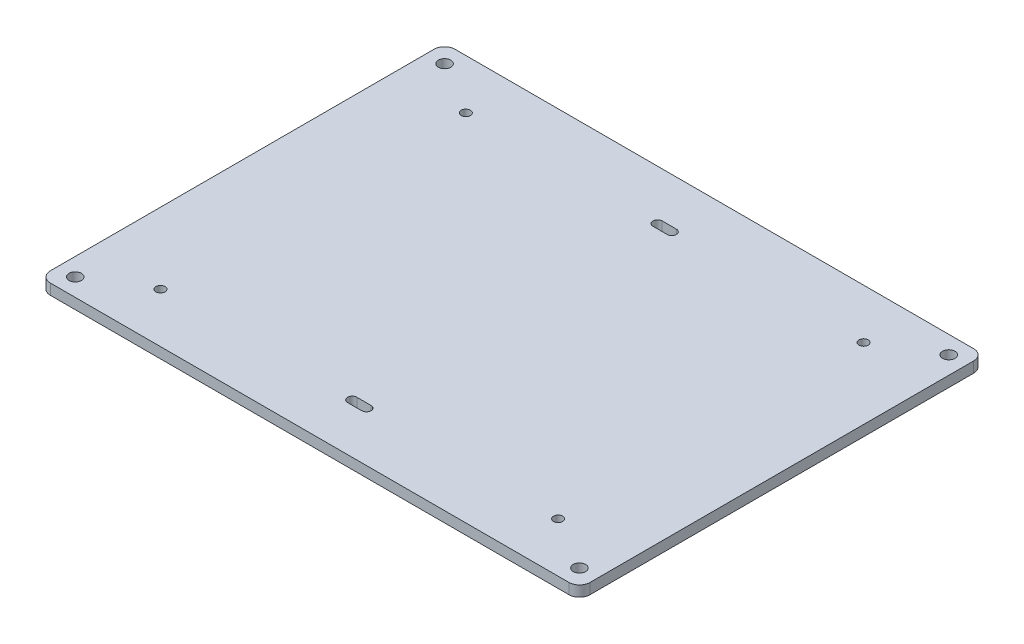
ISO-10303-21;
HEADER;
FILE_DESCRIPTION(('STEP AP214'),'2;1');
FILE_NAME('part.step','',(''),(''),'','','');
FILE_SCHEMA(('AUTOMOTIVE_DESIGN { 1 0 10303 214 1 1 1 1 }'));
ENDSEC;
DATA;
#1=APPLICATION_CONTEXT('core data for automotive mechanical design processes');
#2=APPLICATION_PROTOCOL_DEFINITION('international standard','automotive_design',2000,#1);
#3=PRODUCT_CONTEXT('',#1,'mechanical');
#4=PRODUCT('Part','Part','',(#3));
#5=PRODUCT_RELATED_PRODUCT_CATEGORY('part','',(#4));
#6=PRODUCT_DEFINITION_FORMATION('','',#4);
#7=PRODUCT_DEFINITION_CONTEXT('part definition',#1,'design');
#8=PRODUCT_DEFINITION('design','',#6,#7);
#9=PRODUCT_DEFINITION_SHAPE('','',#8);
#10=(LENGTH_UNIT() NAMED_UNIT(*) SI_UNIT(.MILLI.,.METRE.));
#11=(NAMED_UNIT(*) PLANE_ANGLE_UNIT() SI_UNIT($,.RADIAN.));
#12=(NAMED_UNIT(*) SI_UNIT($,.STERADIAN.) SOLID_ANGLE_UNIT());
#13=UNCERTAINTY_MEASURE_WITH_UNIT(LENGTH_MEASURE(1.E-05),#10,'distance_accuracy_value','');
#14=(GEOMETRIC_REPRESENTATION_CONTEXT(3) GLOBAL_UNCERTAINTY_ASSIGNED_CONTEXT((#13)) GLOBAL_UNIT_ASSIGNED_CONTEXT((#10,
#11,#12)) REPRESENTATION_CONTEXT('',''));
#15=CARTESIAN_POINT('',(0.,0.,0.));
#16=DIRECTION('',(0.,0.,1.));
#17=DIRECTION('',(1.,0.,0.));
#18=AXIS2_PLACEMENT_3D('',#15,#16,#17);
#19=CARTESIAN_POINT('',(-73.,3.,-54.));
#20=DIRECTION('',(0.,1.,0.));
#21=DIRECTION('',(0.,0.,1.));
#22=AXIS2_PLACEMENT_3D('',#19,#20,#21);
#23=PLANE('',#22);
#24=CARTESIAN_POINT('',(55.9999999999991,3.,43.));
#25=DIRECTION('',(0.,1.,0.));
#26=DIRECTION('',(0.,0.,-1.));
#27=AXIS2_PLACEMENT_3D('',#24,#25,#26);
#28=CIRCLE('',#27,1.30000000000002);
#29=CARTESIAN_POINT('',(55.9999999999991,3.,41.7));
#30=VERTEX_POINT('',#29);
#31=EDGE_CURVE('E191',#30,#30,#28,.T.);
#32=ORIENTED_EDGE('',*,*,#31,.F.);
#33=EDGE_LOOP('',(#32));
#34=FACE_BOUND('',#33,.T.);
#35=CARTESIAN_POINT('',(-70.9999999999989,3.,52.));
#36=DIRECTION('',(0.,1.,0.));
#37=DIRECTION('',(0.,0.,1.));
#38=AXIS2_PLACEMENT_3D('',#35,#36,#37);
#39=CIRCLE('',#38,1.75);
#40=CARTESIAN_POINT('',(-70.9999999999989,3.,53.75));
#41=VERTEX_POINT('',#40);
#42=EDGE_CURVE('E234',#41,#41,#39,.T.);
#43=ORIENTED_EDGE('',*,*,#42,.F.);
#44=EDGE_LOOP('',(#43));
#45=FACE_BOUND('',#44,.T.);
#46=CARTESIAN_POINT('',(71.,3.,-52.));
#47=DIRECTION('',(0.,1.,0.));
#48=DIRECTION('',(0.,0.,1.));
#49=AXIS2_PLACEMENT_3D('',#46,#47,#48);
#50=CIRCLE('',#49,1.75);
#51=CARTESIAN_POINT('',(71.,3.,-50.25));
#52=VERTEX_POINT('',#51);
#53=EDGE_CURVE('E246',#52,#52,#50,.T.);
#54=ORIENTED_EDGE('',*,*,#53,.F.);
#55=EDGE_LOOP('',(#54));
#56=FACE_BOUND('',#55,.T.);
#57=CARTESIAN_POINT('',(-71.,3.,-52.));
#58=DIRECTION('',(0.,1.,0.));
#59=DIRECTION('',(0.,0.,1.));
#60=AXIS2_PLACEMENT_3D('',#57,#58,#59);
#61=CIRCLE('',#60,1.75);
#62=CARTESIAN_POINT('',(-71.,3.,-50.25));
#63=VERTEX_POINT('',#62);
#64=EDGE_CURVE('E258',#63,#63,#61,.T.);
#65=ORIENTED_EDGE('',*,*,#64,.F.);
#66=EDGE_LOOP('',(#65));
#67=FACE_BOUND('',#66,.T.);
#68=CARTESIAN_POINT('',(-73.,3.,-54.));
#69=DIRECTION('',(0.,1.,0.));
#70=DIRECTION('',(0.,0.,1.));
#71=AXIS2_PLACEMENT_3D('',#68,#69,#70);
#72=CIRCLE('',#71,3.);
#73=CARTESIAN_POINT('',(-73.,3.,-57.));
#74=VERTEX_POINT('',#73);
#75=CARTESIAN_POINT('',(-76.,3.,-54.));
#76=VERTEX_POINT('',#75);
#77=EDGE_CURVE('E264',#74,#76,#72,.T.);
#78=ORIENTED_EDGE('',*,*,#77,.T.);
#79=DIRECTION('',(0.,0.,1.));
#80=VECTOR('',#79,1.);
#81=CARTESIAN_POINT('',(-76.,3.,-54.));
#82=LINE('',#81,#80);
#83=CARTESIAN_POINT('',(-76.,3.,54.));
#84=VERTEX_POINT('',#83);
#85=EDGE_CURVE('E267',#76,#84,#82,.T.);
#86=ORIENTED_EDGE('',*,*,#85,.T.);
#87=CARTESIAN_POINT('',(-73.,3.,54.));
#88=DIRECTION('',(0.,1.,0.));
#89=DIRECTION('',(0.,0.,-1.));
#90=AXIS2_PLACEMENT_3D('',#87,#88,#89);
#91=CIRCLE('',#90,3.);
#92=CARTESIAN_POINT('',(-73.,3.,57.));
#93=VERTEX_POINT('',#92);
#94=EDGE_CURVE('E270',#84,#93,#91,.T.);
#95=ORIENTED_EDGE('',*,*,#94,.T.);
#96=DIRECTION('',(1.,0.,0.));
#97=VECTOR('',#96,1.);
#98=CARTESIAN_POINT('',(-73.,3.,57.));
#99=LINE('',#98,#97);
#100=CARTESIAN_POINT('',(73.,3.,57.));
#101=VERTEX_POINT('',#100);
#102=EDGE_CURVE('E272',#93,#101,#99,.T.);
#103=ORIENTED_EDGE('',*,*,#102,.T.);
#104=CARTESIAN_POINT('',(73.,3.,54.));
#105=DIRECTION('',(0.,1.,0.));
#106=DIRECTION('',(0.,0.,1.));
#107=AXIS2_PLACEMENT_3D('',#104,#105,#106);
#108=CIRCLE('',#107,3.);
#109=CARTESIAN_POINT('',(76.,3.,54.));
#110=VERTEX_POINT('',#109);
#111=EDGE_CURVE('E274',#101,#110,#108,.T.);
#112=ORIENTED_EDGE('',*,*,#111,.T.);
#113=DIRECTION('',(0.,0.,-1.));
#114=VECTOR('',#113,1.);
#115=CARTESIAN_POINT('',(76.,3.,-54.));
#116=LINE('',#115,#114);
#117=CARTESIAN_POINT('',(76.,3.,-54.));
#118=VERTEX_POINT('',#117);
#119=EDGE_CURVE('E276',#110,#118,#116,.T.);
#120=ORIENTED_EDGE('',*,*,#119,.T.);
#121=CARTESIAN_POINT('',(73.,3.,-54.));
#122=DIRECTION('',(0.,1.,0.));
#123=DIRECTION('',(0.,0.,1.));
#124=AXIS2_PLACEMENT_3D('',#121,#122,#123);
#125=CIRCLE('',#124,3.);
#126=CARTESIAN_POINT('',(72.9999999999999,3.,-57.));
#127=VERTEX_POINT('',#126);
#128=EDGE_CURVE('E278',#118,#127,#125,.T.);
#129=ORIENTED_EDGE('',*,*,#128,.T.);
#130=DIRECTION('',(-1.,0.,0.));
#131=VECTOR('',#130,1.);
#132=CARTESIAN_POINT('',(-73.,3.,-57.));
#133=LINE('',#132,#131);
#134=EDGE_CURVE('E280',#127,#74,#133,.T.);
#135=ORIENTED_EDGE('',*,*,#134,.T.);
#136=EDGE_LOOP('',(#78,#86,#95,#103,#112,#120,#129,#135));
#137=FACE_BOUND('',#136,.T.);
#138=CARTESIAN_POINT('',(-56.,3.,-43.));
#139=DIRECTION('',(0.,1.,0.));
#140=DIRECTION('',(0.,0.,1.));
#141=AXIS2_PLACEMENT_3D('',#138,#139,#140);
#142=CIRCLE('',#141,1.3);
#143=CARTESIAN_POINT('',(-56.,3.,-41.7));
#144=VERTEX_POINT('',#143);
#145=EDGE_CURVE('E252',#144,#144,#142,.T.);
#146=ORIENTED_EDGE('',*,*,#145,.F.);
#147=EDGE_LOOP('',(#146));
#148=FACE_BOUND('',#147,.T.);
#149=CARTESIAN_POINT('',(71.0000000000011,3.,52.));
#150=DIRECTION('',(0.,1.,0.));
#151=DIRECTION('',(0.,0.,1.));
#152=AXIS2_PLACEMENT_3D('',#149,#150,#151);
#153=CIRCLE('',#152,1.75);
#154=CARTESIAN_POINT('',(71.0000000000011,3.,53.75));
#155=VERTEX_POINT('',#154);
#156=EDGE_CURVE('E240',#155,#155,#153,.T.);
#157=ORIENTED_EDGE('',*,*,#156,.F.);
#158=EDGE_LOOP('',(#157));
#159=FACE_BOUND('',#158,.T.);
#160=CARTESIAN_POINT('',(-55.9999999999991,3.,43.));
#161=DIRECTION('',(0.,1.,0.));
#162=DIRECTION('',(0.,0.,1.));
#163=AXIS2_PLACEMENT_3D('',#160,#161,#162);
#164=CIRCLE('',#163,1.3);
#165=CARTESIAN_POINT('',(-55.9999999999991,3.,44.3));
#166=VERTEX_POINT('',#165);
#167=EDGE_CURVE('E228',#166,#166,#164,.T.);
#168=ORIENTED_EDGE('',*,*,#167,.F.);
#169=EDGE_LOOP('',(#168));
#170=FACE_BOUND('',#169,.T.);
#171=DIRECTION('',(1.,0.,0.));
#172=VECTOR('',#171,1.);
#173=CARTESIAN_POINT('',(-2.00000000000007,3.,-41.7));
#174=LINE('',#173,#172);
#175=CARTESIAN_POINT('',(-2.00000000000007,3.,-41.7));
#176=VERTEX_POINT('',#175);
#177=CARTESIAN_POINT('',(1.99999999999999,3.,-41.7));
#178=VERTEX_POINT('',#177);
#179=EDGE_CURVE('E199',#176,#178,#174,.T.);
#180=ORIENTED_EDGE('',*,*,#179,.F.);
#181=CARTESIAN_POINT('',(-2.00000000000007,3.,-43.));
#182=DIRECTION('',(0.,1.,0.));
#183=DIRECTION('',(0.,0.,-1.));
#184=AXIS2_PLACEMENT_3D('',#181,#182,#183);
#185=CIRCLE('',#184,1.3);
#186=CARTESIAN_POINT('',(-2.00000000000007,3.,-44.3));
#187=VERTEX_POINT('',#186);
#188=EDGE_CURVE('E197',#187,#176,#185,.T.);
#189=ORIENTED_EDGE('',*,*,#188,.F.);
#190=DIRECTION('',(-1.,0.,0.));
#191=VECTOR('',#190,1.);
#192=CARTESIAN_POINT('',(-2.00000000000007,3.,-44.3));
#193=LINE('',#192,#191);
#194=CARTESIAN_POINT('',(1.99999999999999,3.,-44.3));
#195=VERTEX_POINT('',#194);
#196=EDGE_CURVE('E205',#195,#187,#193,.T.);
#197=ORIENTED_EDGE('',*,*,#196,.F.);
#198=CARTESIAN_POINT('',(1.99999999999999,3.,-43.));
#199=DIRECTION('',(0.,1.,0.));
#200=DIRECTION('',(0.,0.,1.));
#201=AXIS2_PLACEMENT_3D('',#198,#199,#200);
#202=CIRCLE('',#201,1.3);
#203=EDGE_CURVE('E202',#178,#195,#202,.T.);
#204=ORIENTED_EDGE('',*,*,#203,.F.);
#205=EDGE_LOOP('',(#180,#189,#197,#204));
#206=FACE_BOUND('',#205,.T.);
#207=CARTESIAN_POINT('',(55.9999999999999,3.,-43.));
#208=DIRECTION('',(0.,1.,0.));
#209=DIRECTION('',(0.,0.,-1.));
#210=AXIS2_PLACEMENT_3D('',#207,#208,#209);
#211=CIRCLE('',#210,1.3);
#212=CARTESIAN_POINT('',(55.9999999999999,3.,-44.3));
#213=VERTEX_POINT('',#212);
#214=EDGE_CURVE('E185',#213,#213,#211,.T.);
#215=ORIENTED_EDGE('',*,*,#214,.F.);
#216=EDGE_LOOP('',(#215));
#217=FACE_BOUND('',#216,.T.);
#218=DIRECTION('',(1.,0.,0.));
#219=VECTOR('',#218,1.);
#220=CARTESIAN_POINT('',(-2.00000000000092,3.,44.3));
#221=LINE('',#220,#219);
#222=CARTESIAN_POINT('',(-2.00000000000092,3.,44.3));
#223=VERTEX_POINT('',#222);
#224=CARTESIAN_POINT('',(2.00000000000089,3.,44.3));
#225=VERTEX_POINT('',#224);
#226=EDGE_CURVE('E157',#223,#225,#221,.T.);
#227=ORIENTED_EDGE('',*,*,#226,.F.);
#228=CARTESIAN_POINT('',(-2.00000000000092,3.,43.));
#229=DIRECTION('',(0.,1.,0.));
#230=DIRECTION('',(0.,0.,-1.));
#231=AXIS2_PLACEMENT_3D('',#228,#229,#230);
#232=CIRCLE('',#231,1.3);
#233=CARTESIAN_POINT('',(-2.00000000000092,3.,41.7));
#234=VERTEX_POINT('',#233);
#235=EDGE_CURVE('E149',#234,#223,#232,.T.);
#236=ORIENTED_EDGE('',*,*,#235,.F.);
#237=DIRECTION('',(-1.,0.,0.));
#238=VECTOR('',#237,1.);
#239=CARTESIAN_POINT('',(-2.00000000000092,3.,41.7));
#240=LINE('',#239,#238);
#241=CARTESIAN_POINT('',(2.00000000000089,3.,41.7));
#242=VERTEX_POINT('',#241);
#243=EDGE_CURVE('E171',#242,#234,#240,.T.);
#244=ORIENTED_EDGE('',*,*,#243,.F.);
#245=CARTESIAN_POINT('',(2.00000000000089,3.,43.));
#246=DIRECTION('',(0.,1.,0.));
#247=DIRECTION('',(0.,0.,1.));
#248=AXIS2_PLACEMENT_3D('',#245,#246,#247);
#249=CIRCLE('',#248,1.3);
#250=EDGE_CURVE('E169',#225,#242,#249,.T.);
#251=ORIENTED_EDGE('',*,*,#250,.F.);
#252=EDGE_LOOP('',(#227,#236,#244,#251));
#253=FACE_BOUND('',#252,.T.);
#254=ADVANCED_FACE('F36',(#34,#45,#56,#67,#137,#148,#159,#170,#206,#217,#253),#23,.T.);
#255=CARTESIAN_POINT('',(-73.,0.,-54.));
#256=DIRECTION('',(0.,1.,0.));
#257=DIRECTION('',(0.,0.,1.));
#258=AXIS2_PLACEMENT_3D('',#255,#256,#257);
#259=PLANE('',#258);
#260=CARTESIAN_POINT('',(55.9999999999999,0.,-43.));
#261=DIRECTION('',(0.,1.,0.));
#262=DIRECTION('',(0.,0.,-1.));
#263=AXIS2_PLACEMENT_3D('',#260,#261,#262);
#264=CIRCLE('',#263,1.3);
#265=CARTESIAN_POINT('',(55.9999999999999,0.,-44.3));
#266=VERTEX_POINT('',#265);
#267=EDGE_CURVE('E165',#266,#266,#264,.T.);
#268=ORIENTED_EDGE('',*,*,#267,.T.);
#269=EDGE_LOOP('',(#268));
#270=FACE_BOUND('',#269,.T.);
#271=CARTESIAN_POINT('',(55.9999999999991,0.,43.));
#272=DIRECTION('',(0.,1.,0.));
#273=DIRECTION('',(0.,0.,-1.));
#274=AXIS2_PLACEMENT_3D('',#271,#272,#273);
#275=CIRCLE('',#274,1.30000000000002);
#276=CARTESIAN_POINT('',(55.9999999999991,0.,41.7));
#277=VERTEX_POINT('',#276);
#278=EDGE_CURVE('E188',#277,#277,#275,.T.);
#279=ORIENTED_EDGE('',*,*,#278,.T.);
#280=EDGE_LOOP('',(#279));
#281=FACE_BOUND('',#280,.T.);
#282=CARTESIAN_POINT('',(-2.00000000000007,0.,-43.));
#283=DIRECTION('',(0.,1.,0.));
#284=DIRECTION('',(0.,0.,-1.));
#285=AXIS2_PLACEMENT_3D('',#282,#283,#284);
#286=CIRCLE('',#285,1.3);
#287=CARTESIAN_POINT('',(-2.00000000000007,0.,-44.3));
#288=VERTEX_POINT('',#287);
#289=CARTESIAN_POINT('',(-2.00000000000007,0.,-41.7));
#290=VERTEX_POINT('',#289);
#291=EDGE_CURVE('E194',#288,#290,#286,.T.);
#292=ORIENTED_EDGE('',*,*,#291,.T.);
#293=DIRECTION('',(1.,0.,0.));
#294=VECTOR('',#293,1.);
#295=CARTESIAN_POINT('',(-2.00000000000007,0.,-41.7));
#296=LINE('',#295,#294);
#297=CARTESIAN_POINT('',(1.99999999999999,0.,-41.7));
#298=VERTEX_POINT('',#297);
#299=EDGE_CURVE('E210',#290,#298,#296,.T.);
#300=ORIENTED_EDGE('',*,*,#299,.T.);
#301=CARTESIAN_POINT('',(1.99999999999999,0.,-43.));
#302=DIRECTION('',(0.,1.,0.));
#303=DIRECTION('',(0.,0.,1.));
#304=AXIS2_PLACEMENT_3D('',#301,#302,#303);
#305=CIRCLE('',#304,1.3);
#306=CARTESIAN_POINT('',(1.99999999999999,0.,-44.3));
#307=VERTEX_POINT('',#306);
#308=EDGE_CURVE('E213',#298,#307,#305,.T.);
#309=ORIENTED_EDGE('',*,*,#308,.T.);
#310=DIRECTION('',(-1.,0.,0.));
#311=VECTOR('',#310,1.);
#312=CARTESIAN_POINT('',(-2.00000000000007,0.,-44.3));
#313=LINE('',#312,#311);
#314=EDGE_CURVE('E200',#307,#288,#313,.T.);
#315=ORIENTED_EDGE('',*,*,#314,.T.);
#316=EDGE_LOOP('',(#292,#300,#309,#315));
#317=FACE_BOUND('',#316,.T.);
#318=CARTESIAN_POINT('',(-73.,0.,-54.));
#319=DIRECTION('',(0.,1.,0.));
#320=DIRECTION('',(0.,0.,1.));
#321=AXIS2_PLACEMENT_3D('',#318,#319,#320);
#322=CIRCLE('',#321,3.);
#323=CARTESIAN_POINT('',(-73.,0.,-57.));
#324=VERTEX_POINT('',#323);
#325=CARTESIAN_POINT('',(-76.,0.,-54.));
#326=VERTEX_POINT('',#325);
#327=EDGE_CURVE('E261',#324,#326,#322,.T.);
#328=ORIENTED_EDGE('',*,*,#327,.F.);
#329=DIRECTION('',(-1.,0.,0.));
#330=VECTOR('',#329,1.);
#331=CARTESIAN_POINT('',(-73.,0.,-57.));
#332=LINE('',#331,#330);
#333=CARTESIAN_POINT('',(72.9999999999999,0.,-57.));
#334=VERTEX_POINT('',#333);
#335=EDGE_CURVE('E268',#334,#324,#332,.T.);
#336=ORIENTED_EDGE('',*,*,#335,.F.);
#337=CARTESIAN_POINT('',(73.,0.,-54.));
#338=DIRECTION('',(0.,1.,0.));
#339=DIRECTION('',(0.,0.,1.));
#340=AXIS2_PLACEMENT_3D('',#337,#338,#339);
#341=CIRCLE('',#340,3.);
#342=CARTESIAN_POINT('',(76.,0.,-54.));
#343=VERTEX_POINT('',#342);
#344=EDGE_CURVE('E295',#343,#334,#341,.T.);
#345=ORIENTED_EDGE('',*,*,#344,.F.);
#346=DIRECTION('',(0.,0.,-1.));
#347=VECTOR('',#346,1.);
#348=CARTESIAN_POINT('',(76.,0.,-54.));
#349=LINE('',#348,#347);
#350=CARTESIAN_POINT('',(76.,0.,54.));
#351=VERTEX_POINT('',#350);
#352=EDGE_CURVE('E293',#351,#343,#349,.T.);
#353=ORIENTED_EDGE('',*,*,#352,.F.);
#354=CARTESIAN_POINT('',(73.,0.,54.));
#355=DIRECTION('',(0.,1.,0.));
#356=DIRECTION('',(0.,0.,1.));
#357=AXIS2_PLACEMENT_3D('',#354,#355,#356);
#358=CIRCLE('',#357,3.);
#359=CARTESIAN_POINT('',(73.,0.,57.));
#360=VERTEX_POINT('',#359);
#361=EDGE_CURVE('E291',#360,#351,#358,.T.);
#362=ORIENTED_EDGE('',*,*,#361,.F.);
#363=DIRECTION('',(1.,0.,0.));
#364=VECTOR('',#363,1.);
#365=CARTESIAN_POINT('',(-73.,0.,57.));
#366=LINE('',#365,#364);
#367=CARTESIAN_POINT('',(-73.,0.,57.));
#368=VERTEX_POINT('',#367);
#369=EDGE_CURVE('E289',#368,#360,#366,.T.);
#370=ORIENTED_EDGE('',*,*,#369,.F.);
#371=CARTESIAN_POINT('',(-73.,0.,54.));
#372=DIRECTION('',(0.,1.,0.));
#373=DIRECTION('',(0.,0.,-1.));
#374=AXIS2_PLACEMENT_3D('',#371,#372,#373);
#375=CIRCLE('',#374,3.);
#376=CARTESIAN_POINT('',(-76.,0.,54.));
#377=VERTEX_POINT('',#376);
#378=EDGE_CURVE('E287',#377,#368,#375,.T.);
#379=ORIENTED_EDGE('',*,*,#378,.F.);
#380=DIRECTION('',(0.,0.,1.));
#381=VECTOR('',#380,1.);
#382=CARTESIAN_POINT('',(-76.,0.,-54.));
#383=LINE('',#382,#381);
#384=EDGE_CURVE('E285',#326,#377,#383,.T.);
#385=ORIENTED_EDGE('',*,*,#384,.F.);
#386=EDGE_LOOP('',(#328,#336,#345,#353,#362,#370,#379,#385));
#387=FACE_BOUND('',#386,.T.);
#388=CARTESIAN_POINT('',(-71.,0.,-52.));
#389=DIRECTION('',(0.,1.,0.));
#390=DIRECTION('',(0.,0.,1.));
#391=AXIS2_PLACEMENT_3D('',#388,#389,#390);
#392=CIRCLE('',#391,1.75);
#393=CARTESIAN_POINT('',(-71.,0.,-50.25));
#394=VERTEX_POINT('',#393);
#395=EDGE_CURVE('E255',#394,#394,#392,.T.);
#396=ORIENTED_EDGE('',*,*,#395,.T.);
#397=EDGE_LOOP('',(#396));
#398=FACE_BOUND('',#397,.T.);
#399=CARTESIAN_POINT('',(-56.,0.,-43.));
#400=DIRECTION('',(0.,1.,0.));
#401=DIRECTION('',(0.,0.,1.));
#402=AXIS2_PLACEMENT_3D('',#399,#400,#401);
#403=CIRCLE('',#402,1.3);
#404=CARTESIAN_POINT('',(-56.,0.,-41.7));
#405=VERTEX_POINT('',#404);
#406=EDGE_CURVE('E249',#405,#405,#403,.T.);
#407=ORIENTED_EDGE('',*,*,#406,.T.);
#408=EDGE_LOOP('',(#407));
#409=FACE_BOUND('',#408,.T.);
#410=CARTESIAN_POINT('',(71.,0.,-52.));
#411=DIRECTION('',(0.,1.,0.));
#412=DIRECTION('',(0.,0.,1.));
#413=AXIS2_PLACEMENT_3D('',#410,#411,#412);
#414=CIRCLE('',#413,1.75);
#415=CARTESIAN_POINT('',(71.,0.,-50.25));
#416=VERTEX_POINT('',#415);
#417=EDGE_CURVE('E243',#416,#416,#414,.T.);
#418=ORIENTED_EDGE('',*,*,#417,.T.);
#419=EDGE_LOOP('',(#418));
#420=FACE_BOUND('',#419,.T.);
#421=CARTESIAN_POINT('',(71.0000000000011,0.,52.));
#422=DIRECTION('',(0.,1.,0.));
#423=DIRECTION('',(0.,0.,1.));
#424=AXIS2_PLACEMENT_3D('',#421,#422,#423);
#425=CIRCLE('',#424,1.75);
#426=CARTESIAN_POINT('',(71.0000000000011,0.,53.75));
#427=VERTEX_POINT('',#426);
#428=EDGE_CURVE('E237',#427,#427,#425,.T.);
#429=ORIENTED_EDGE('',*,*,#428,.T.);
#430=EDGE_LOOP('',(#429));
#431=FACE_BOUND('',#430,.T.);
#432=CARTESIAN_POINT('',(-70.9999999999989,0.,52.));
#433=DIRECTION('',(0.,1.,0.));
#434=DIRECTION('',(0.,0.,1.));
#435=AXIS2_PLACEMENT_3D('',#432,#433,#434);
#436=CIRCLE('',#435,1.75);
#437=CARTESIAN_POINT('',(-70.9999999999989,0.,53.75));
#438=VERTEX_POINT('',#437);
#439=EDGE_CURVE('E231',#438,#438,#436,.T.);
#440=ORIENTED_EDGE('',*,*,#439,.T.);
#441=EDGE_LOOP('',(#440));
#442=FACE_BOUND('',#441,.T.);
#443=CARTESIAN_POINT('',(-55.9999999999991,0.,43.));
#444=DIRECTION('',(0.,1.,0.));
#445=DIRECTION('',(0.,0.,1.));
#446=AXIS2_PLACEMENT_3D('',#443,#444,#445);
#447=CIRCLE('',#446,1.3);
#448=CARTESIAN_POINT('',(-55.9999999999991,0.,44.3));
#449=VERTEX_POINT('',#448);
#450=EDGE_CURVE('E227',#449,#449,#447,.T.);
#451=ORIENTED_EDGE('',*,*,#450,.T.);
#452=EDGE_LOOP('',(#451));
#453=FACE_BOUND('',#452,.T.);
#454=CARTESIAN_POINT('',(-2.00000000000092,0.,43.));
#455=DIRECTION('',(0.,1.,0.));
#456=DIRECTION('',(0.,0.,-1.));
#457=AXIS2_PLACEMENT_3D('',#454,#455,#456);
#458=CIRCLE('',#457,1.3);
#459=CARTESIAN_POINT('',(-2.00000000000092,0.,41.7));
#460=VERTEX_POINT('',#459);
#461=CARTESIAN_POINT('',(-2.00000000000092,0.,44.3));
#462=VERTEX_POINT('',#461);
#463=EDGE_CURVE('E59',#460,#462,#458,.T.);
#464=ORIENTED_EDGE('',*,*,#463,.T.);
#465=DIRECTION('',(1.,0.,0.));
#466=VECTOR('',#465,1.);
#467=CARTESIAN_POINT('',(-2.00000000000092,0.,44.3));
#468=LINE('',#467,#466);
#469=CARTESIAN_POINT('',(2.00000000000089,0.,44.3));
#470=VERTEX_POINT('',#469);
#471=EDGE_CURVE('E164',#462,#470,#468,.T.);
#472=ORIENTED_EDGE('',*,*,#471,.T.);
#473=CARTESIAN_POINT('',(2.00000000000089,0.,43.));
#474=DIRECTION('',(0.,1.,0.));
#475=DIRECTION('',(0.,0.,1.));
#476=AXIS2_PLACEMENT_3D('',#473,#474,#475);
#477=CIRCLE('',#476,1.3);
#478=CARTESIAN_POINT('',(2.00000000000089,0.,41.7));
#479=VERTEX_POINT('',#478);
#480=EDGE_CURVE('E177',#470,#479,#477,.T.);
#481=ORIENTED_EDGE('',*,*,#480,.T.);
#482=DIRECTION('',(-1.,0.,0.));
#483=VECTOR('',#482,1.);
#484=CARTESIAN_POINT('',(-2.00000000000092,0.,41.7));
#485=LINE('',#484,#483);
#486=EDGE_CURVE('E158',#479,#460,#485,.T.);
#487=ORIENTED_EDGE('',*,*,#486,.T.);
#488=EDGE_LOOP('',(#464,#472,#481,#487));
#489=FACE_BOUND('',#488,.T.);
#490=ADVANCED_FACE('F325',(#270,#281,#317,#387,#398,#409,#420,#431,#442,#453,#489),#259,.F.);
#491=CARTESIAN_POINT('',(-73.,3.,-54.));
#492=DIRECTION('',(0.,-1.,0.));
#493=DIRECTION('',(0.,0.,-1.));
#494=AXIS2_PLACEMENT_3D('',#491,#492,#493);
#495=CYLINDRICAL_SURFACE('',#494,3.);
#496=ORIENTED_EDGE('',*,*,#327,.T.);
#497=DIRECTION('',(0.,-1.,0.));
#498=VECTOR('',#497,1.);
#499=CARTESIAN_POINT('',(-76.,3.,-54.));
#500=LINE('',#499,#498);
#501=EDGE_CURVE('E11',#76,#326,#500,.T.);
#502=ORIENTED_EDGE('',*,*,#501,.F.);
#503=ORIENTED_EDGE('',*,*,#77,.F.);
#504=DIRECTION('',(0.,-1.,0.));
#505=VECTOR('',#504,1.);
#506=CARTESIAN_POINT('',(-73.,3.,-57.));
#507=LINE('',#506,#505);
#508=EDGE_CURVE('E282',#74,#324,#507,.T.);
#509=ORIENTED_EDGE('',*,*,#508,.T.);
#510=EDGE_LOOP('',(#496,#502,#503,#509));
#511=FACE_BOUND('',#510,.T.);
#512=ADVANCED_FACE('F38',(#511),#495,.T.);
#513=CARTESIAN_POINT('',(-76.,3.,-54.));
#514=DIRECTION('',(1.,0.,0.));
#515=DIRECTION('',(0.,0.,-1.));
#516=AXIS2_PLACEMENT_3D('',#513,#514,#515);
#517=PLANE('',#516);
#518=ORIENTED_EDGE('',*,*,#384,.T.);
#519=DIRECTION('',(0.,-1.,0.));
#520=VECTOR('',#519,1.);
#521=CARTESIAN_POINT('',(-76.,3.,54.));
#522=LINE('',#521,#520);
#523=EDGE_CURVE('E44',#84,#377,#522,.T.);
#524=ORIENTED_EDGE('',*,*,#523,.F.);
#525=ORIENTED_EDGE('',*,*,#85,.F.);
#526=ORIENTED_EDGE('',*,*,#501,.T.);
#527=EDGE_LOOP('',(#518,#524,#525,#526));
#528=FACE_BOUND('',#527,.T.);
#529=ADVANCED_FACE('F343',(#528),#517,.F.);
#530=CARTESIAN_POINT('',(-73.,3.,54.));
#531=DIRECTION('',(0.,-1.,0.));
#532=DIRECTION('',(0.,0.,-1.));
#533=AXIS2_PLACEMENT_3D('',#530,#531,#532);
#534=CYLINDRICAL_SURFACE('',#533,3.);
#535=ORIENTED_EDGE('',*,*,#378,.T.);
#536=DIRECTION('',(0.,-1.,0.));
#537=VECTOR('',#536,1.);
#538=CARTESIAN_POINT('',(-73.,3.,57.));
#539=LINE('',#538,#537);
#540=EDGE_CURVE('E312',#93,#368,#539,.T.);
#541=ORIENTED_EDGE('',*,*,#540,.F.);
#542=ORIENTED_EDGE('',*,*,#94,.F.);
#543=ORIENTED_EDGE('',*,*,#523,.T.);
#544=EDGE_LOOP('',(#535,#541,#542,#543));
#545=FACE_BOUND('',#544,.T.);
#546=ADVANCED_FACE('F319',(#545),#534,.T.);
#547=CARTESIAN_POINT('',(-73.,3.,57.));
#548=DIRECTION('',(0.,0.,-1.));
#549=DIRECTION('',(-1.,0.,0.));
#550=AXIS2_PLACEMENT_3D('',#547,#548,#549);
#551=PLANE('',#550);
#552=ORIENTED_EDGE('',*,*,#369,.T.);
#553=DIRECTION('',(0.,-1.,0.));
#554=VECTOR('',#553,1.);
#555=CARTESIAN_POINT('',(73.,3.,57.));
#556=LINE('',#555,#554);
#557=EDGE_CURVE('E309',#101,#360,#556,.T.);
#558=ORIENTED_EDGE('',*,*,#557,.F.);
#559=ORIENTED_EDGE('',*,*,#102,.F.);
#560=ORIENTED_EDGE('',*,*,#540,.T.);
#561=EDGE_LOOP('',(#552,#558,#559,#560));
#562=FACE_BOUND('',#561,.T.);
#563=ADVANCED_FACE('F331',(#562),#551,.F.);
#564=CARTESIAN_POINT('',(73.,3.,54.));
#565=DIRECTION('',(0.,-1.,0.));
#566=DIRECTION('',(0.,0.,-1.));
#567=AXIS2_PLACEMENT_3D('',#564,#565,#566);
#568=CYLINDRICAL_SURFACE('',#567,3.);
#569=ORIENTED_EDGE('',*,*,#361,.T.);
#570=DIRECTION('',(0.,-1.,0.));
#571=VECTOR('',#570,1.);
#572=CARTESIAN_POINT('',(76.,3.,54.));
#573=LINE('',#572,#571);
#574=EDGE_CURVE('E306',#110,#351,#573,.T.);
#575=ORIENTED_EDGE('',*,*,#574,.F.);
#576=ORIENTED_EDGE('',*,*,#111,.F.);
#577=ORIENTED_EDGE('',*,*,#557,.T.);
#578=EDGE_LOOP('',(#569,#575,#576,#577));
#579=FACE_BOUND('',#578,.T.);
#580=ADVANCED_FACE('F335',(#579),#568,.T.);
#581=CARTESIAN_POINT('',(76.,3.,-54.));
#582=DIRECTION('',(-1.,0.,0.));
#583=DIRECTION('',(0.,0.,1.));
#584=AXIS2_PLACEMENT_3D('',#581,#582,#583);
#585=PLANE('',#584);
#586=ORIENTED_EDGE('',*,*,#352,.T.);
#587=DIRECTION('',(0.,-1.,0.));
#588=VECTOR('',#587,1.);
#589=CARTESIAN_POINT('',(76.,3.,-54.));
#590=LINE('',#589,#588);
#591=EDGE_CURVE('E303',#118,#343,#590,.T.);
#592=ORIENTED_EDGE('',*,*,#591,.F.);
#593=ORIENTED_EDGE('',*,*,#119,.F.);
#594=ORIENTED_EDGE('',*,*,#574,.T.);
#595=EDGE_LOOP('',(#586,#592,#593,#594));
#596=FACE_BOUND('',#595,.T.);
#597=ADVANCED_FACE('F356',(#596),#585,.F.);
#598=CARTESIAN_POINT('',(73.,3.,-54.));
#599=DIRECTION('',(0.,-1.,0.));
#600=DIRECTION('',(0.,0.,-1.));
#601=AXIS2_PLACEMENT_3D('',#598,#599,#600);
#602=CYLINDRICAL_SURFACE('',#601,3.);
#603=ORIENTED_EDGE('',*,*,#344,.T.);
#604=DIRECTION('',(0.,-1.,0.));
#605=VECTOR('',#604,1.);
#606=CARTESIAN_POINT('',(72.9999999999999,3.,-57.));
#607=LINE('',#606,#605);
#608=EDGE_CURVE('E300',#127,#334,#607,.T.);
#609=ORIENTED_EDGE('',*,*,#608,.F.);
#610=ORIENTED_EDGE('',*,*,#128,.F.);
#611=ORIENTED_EDGE('',*,*,#591,.T.);
#612=EDGE_LOOP('',(#603,#609,#610,#611));
#613=FACE_BOUND('',#612,.T.);
#614=ADVANCED_FACE('F354',(#613),#602,.T.);
#615=CARTESIAN_POINT('',(-73.,3.,-57.));
#616=DIRECTION('',(0.,0.,1.));
#617=DIRECTION('',(1.,0.,0.));
#618=AXIS2_PLACEMENT_3D('',#615,#616,#617);
#619=PLANE('',#618);
#620=ORIENTED_EDGE('',*,*,#335,.T.);
#621=ORIENTED_EDGE('',*,*,#508,.F.);
#622=ORIENTED_EDGE('',*,*,#134,.F.);
#623=ORIENTED_EDGE('',*,*,#608,.T.);
#624=EDGE_LOOP('',(#620,#621,#622,#623));
#625=FACE_BOUND('',#624,.T.);
#626=ADVANCED_FACE('F349',(#625),#619,.F.);
#627=CARTESIAN_POINT('',(-71.,3.,-52.));
#628=DIRECTION('',(0.,-1.,0.));
#629=DIRECTION('',(0.,0.,-1.));
#630=AXIS2_PLACEMENT_3D('',#627,#628,#629);
#631=CYLINDRICAL_SURFACE('',#630,1.75);
#632=ORIENTED_EDGE('',*,*,#64,.T.);
#633=EDGE_LOOP('',(#632));
#634=FACE_BOUND('',#633,.T.);
#635=ORIENTED_EDGE('',*,*,#395,.F.);
#636=EDGE_LOOP('',(#635));
#637=FACE_BOUND('',#636,.T.);
#638=ADVANCED_FACE('F376',(#634,#637),#631,.F.);
#639=CARTESIAN_POINT('',(-56.,3.,-43.));
#640=DIRECTION('',(0.,-1.,0.));
#641=DIRECTION('',(0.,0.,-1.));
#642=AXIS2_PLACEMENT_3D('',#639,#640,#641);
#643=CYLINDRICAL_SURFACE('',#642,1.3);
#644=ORIENTED_EDGE('',*,*,#145,.T.);
#645=EDGE_LOOP('',(#644));
#646=FACE_BOUND('',#645,.T.);
#647=ORIENTED_EDGE('',*,*,#406,.F.);
#648=EDGE_LOOP('',(#647));
#649=FACE_BOUND('',#648,.T.);
#650=ADVANCED_FACE('F383',(#646,#649),#643,.F.);
#651=CARTESIAN_POINT('',(71.,3.,-52.));
#652=DIRECTION('',(0.,-1.,0.));
#653=DIRECTION('',(0.,0.,-1.));
#654=AXIS2_PLACEMENT_3D('',#651,#652,#653);
#655=CYLINDRICAL_SURFACE('',#654,1.75);
#656=ORIENTED_EDGE('',*,*,#53,.T.);
#657=EDGE_LOOP('',(#656));
#658=FACE_BOUND('',#657,.T.);
#659=ORIENTED_EDGE('',*,*,#417,.F.);
#660=EDGE_LOOP('',(#659));
#661=FACE_BOUND('',#660,.T.);
#662=ADVANCED_FACE('F388',(#658,#661),#655,.F.);
#663=CARTESIAN_POINT('',(71.0000000000011,3.,52.));
#664=DIRECTION('',(0.,-1.,0.));
#665=DIRECTION('',(0.,0.,-1.));
#666=AXIS2_PLACEMENT_3D('',#663,#664,#665);
#667=CYLINDRICAL_SURFACE('',#666,1.75);
#668=ORIENTED_EDGE('',*,*,#156,.T.);
#669=EDGE_LOOP('',(#668));
#670=FACE_BOUND('',#669,.T.);
#671=ORIENTED_EDGE('',*,*,#428,.F.);
#672=EDGE_LOOP('',(#671));
#673=FACE_BOUND('',#672,.T.);
#674=ADVANCED_FACE('F450',(#670,#673),#667,.F.);
#675=CARTESIAN_POINT('',(-70.9999999999989,3.,52.));
#676=DIRECTION('',(0.,-1.,0.));
#677=DIRECTION('',(0.,0.,-1.));
#678=AXIS2_PLACEMENT_3D('',#675,#676,#677);
#679=CYLINDRICAL_SURFACE('',#678,1.75);
#680=ORIENTED_EDGE('',*,*,#42,.T.);
#681=EDGE_LOOP('',(#680));
#682=FACE_BOUND('',#681,.T.);
#683=ORIENTED_EDGE('',*,*,#439,.F.);
#684=EDGE_LOOP('',(#683));
#685=FACE_BOUND('',#684,.T.);
#686=ADVANCED_FACE('F446',(#682,#685),#679,.F.);
#687=CARTESIAN_POINT('',(-55.9999999999991,3.,43.));
#688=DIRECTION('',(0.,-1.,0.));
#689=DIRECTION('',(0.,0.,-1.));
#690=AXIS2_PLACEMENT_3D('',#687,#688,#689);
#691=CYLINDRICAL_SURFACE('',#690,1.3);
#692=ORIENTED_EDGE('',*,*,#167,.T.);
#693=EDGE_LOOP('',(#692));
#694=FACE_BOUND('',#693,.T.);
#695=ORIENTED_EDGE('',*,*,#450,.F.);
#696=EDGE_LOOP('',(#695));
#697=FACE_BOUND('',#696,.T.);
#698=ADVANCED_FACE('F442',(#694,#697),#691,.F.);
#699=CARTESIAN_POINT('',(-2.00000000000007,3.,-43.));
#700=DIRECTION('',(0.,-1.,0.));
#701=DIRECTION('',(0.,0.,-1.));
#702=AXIS2_PLACEMENT_3D('',#699,#700,#701);
#703=CYLINDRICAL_SURFACE('',#702,1.3);
#704=ORIENTED_EDGE('',*,*,#291,.F.);
#705=DIRECTION('',(0.,-1.,0.));
#706=VECTOR('',#705,1.);
#707=CARTESIAN_POINT('',(-2.00000000000007,3.,-44.3));
#708=LINE('',#707,#706);
#709=EDGE_CURVE('E207',#187,#288,#708,.T.);
#710=ORIENTED_EDGE('',*,*,#709,.F.);
#711=ORIENTED_EDGE('',*,*,#188,.T.);
#712=DIRECTION('',(0.,-1.,0.));
#713=VECTOR('',#712,1.);
#714=CARTESIAN_POINT('',(-2.00000000000007,3.,-41.7));
#715=LINE('',#714,#713);
#716=EDGE_CURVE('E224',#176,#290,#715,.T.);
#717=ORIENTED_EDGE('',*,*,#716,.T.);
#718=EDGE_LOOP('',(#704,#710,#711,#717));
#719=FACE_BOUND('',#718,.T.);
#720=ADVANCED_FACE('F438',(#719),#703,.F.);
#721=CARTESIAN_POINT('',(-2.00000000000007,3.,-41.7));
#722=DIRECTION('',(0.,0.,-1.));
#723=DIRECTION('',(-1.,0.,0.));
#724=AXIS2_PLACEMENT_3D('',#721,#722,#723);
#725=PLANE('',#724);
#726=ORIENTED_EDGE('',*,*,#299,.F.);
#727=ORIENTED_EDGE('',*,*,#716,.F.);
#728=ORIENTED_EDGE('',*,*,#179,.T.);
#729=DIRECTION('',(0.,-1.,0.));
#730=VECTOR('',#729,1.);
#731=CARTESIAN_POINT('',(1.99999999999999,3.,-41.7));
#732=LINE('',#731,#730);
#733=EDGE_CURVE('E222',#178,#298,#732,.T.);
#734=ORIENTED_EDGE('',*,*,#733,.T.);
#735=EDGE_LOOP('',(#726,#727,#728,#734));
#736=FACE_BOUND('',#735,.T.);
#737=ADVANCED_FACE('F434',(#736),#725,.T.);
#738=CARTESIAN_POINT('',(1.99999999999999,3.,-43.));
#739=DIRECTION('',(0.,-1.,0.));
#740=DIRECTION('',(0.,0.,-1.));
#741=AXIS2_PLACEMENT_3D('',#738,#739,#740);
#742=CYLINDRICAL_SURFACE('',#741,1.3);
#743=ORIENTED_EDGE('',*,*,#308,.F.);
#744=ORIENTED_EDGE('',*,*,#733,.F.);
#745=ORIENTED_EDGE('',*,*,#203,.T.);
#746=DIRECTION('',(0.,-1.,0.));
#747=VECTOR('',#746,1.);
#748=CARTESIAN_POINT('',(1.99999999999999,3.,-44.3));
#749=LINE('',#748,#747);
#750=EDGE_CURVE('E220',#195,#307,#749,.T.);
#751=ORIENTED_EDGE('',*,*,#750,.T.);
#752=EDGE_LOOP('',(#743,#744,#745,#751));
#753=FACE_BOUND('',#752,.T.);
#754=ADVANCED_FACE('F430',(#753),#742,.F.);
#755=CARTESIAN_POINT('',(-2.00000000000007,3.,-44.3));
#756=DIRECTION('',(0.,0.,1.));
#757=DIRECTION('',(1.,0.,0.));
#758=AXIS2_PLACEMENT_3D('',#755,#756,#757);
#759=PLANE('',#758);
#760=ORIENTED_EDGE('',*,*,#314,.F.);
#761=ORIENTED_EDGE('',*,*,#750,.F.);
#762=ORIENTED_EDGE('',*,*,#196,.T.);
#763=ORIENTED_EDGE('',*,*,#709,.T.);
#764=EDGE_LOOP('',(#760,#761,#762,#763));
#765=FACE_BOUND('',#764,.T.);
#766=ADVANCED_FACE('F426',(#765),#759,.T.);
#767=CARTESIAN_POINT('',(55.9999999999991,3.,43.));
#768=DIRECTION('',(0.,-1.,0.));
#769=DIRECTION('',(0.,0.,-1.));
#770=AXIS2_PLACEMENT_3D('',#767,#768,#769);
#771=CYLINDRICAL_SURFACE('',#770,1.30000000000002);
#772=ORIENTED_EDGE('',*,*,#31,.T.);
#773=EDGE_LOOP('',(#772));
#774=FACE_BOUND('',#773,.T.);
#775=ORIENTED_EDGE('',*,*,#278,.F.);
#776=EDGE_LOOP('',(#775));
#777=FACE_BOUND('',#776,.T.);
#778=ADVANCED_FACE('F422',(#774,#777),#771,.F.);
#779=CARTESIAN_POINT('',(55.9999999999999,3.,-43.));
#780=DIRECTION('',(0.,-1.,0.));
#781=DIRECTION('',(0.,0.,-1.));
#782=AXIS2_PLACEMENT_3D('',#779,#780,#781);
#783=CYLINDRICAL_SURFACE('',#782,1.3);
#784=ORIENTED_EDGE('',*,*,#214,.T.);
#785=EDGE_LOOP('',(#784));
#786=FACE_BOUND('',#785,.T.);
#787=ORIENTED_EDGE('',*,*,#267,.F.);
#788=EDGE_LOOP('',(#787));
#789=FACE_BOUND('',#788,.T.);
#790=ADVANCED_FACE('F419',(#786,#789),#783,.F.);
#791=CARTESIAN_POINT('',(-2.00000000000092,3.,43.));
#792=DIRECTION('',(0.,-1.,0.));
#793=DIRECTION('',(0.,0.,-1.));
#794=AXIS2_PLACEMENT_3D('',#791,#792,#793);
#795=CYLINDRICAL_SURFACE('',#794,1.3);
#796=ORIENTED_EDGE('',*,*,#463,.F.);
#797=DIRECTION('',(0.,-1.,0.));
#798=VECTOR('',#797,1.);
#799=CARTESIAN_POINT('',(-2.00000000000092,3.,41.7));
#800=LINE('',#799,#798);
#801=EDGE_CURVE('E153',#234,#460,#800,.T.);
#802=ORIENTED_EDGE('',*,*,#801,.F.);
#803=ORIENTED_EDGE('',*,*,#235,.T.);
#804=DIRECTION('',(0.,-1.,0.));
#805=VECTOR('',#804,1.);
#806=CARTESIAN_POINT('',(-2.00000000000092,3.,44.3));
#807=LINE('',#806,#805);
#808=EDGE_CURVE('E152',#223,#462,#807,.T.);
#809=ORIENTED_EDGE('',*,*,#808,.T.);
#810=EDGE_LOOP('',(#796,#802,#803,#809));
#811=FACE_BOUND('',#810,.T.);
#812=ADVANCED_FACE('F151',(#811),#795,.F.);
#813=CARTESIAN_POINT('',(-2.00000000000092,3.,44.3));
#814=DIRECTION('',(0.,0.,-1.));
#815=DIRECTION('',(-1.,0.,0.));
#816=AXIS2_PLACEMENT_3D('',#813,#814,#815);
#817=PLANE('',#816);
#818=ORIENTED_EDGE('',*,*,#471,.F.);
#819=ORIENTED_EDGE('',*,*,#808,.F.);
#820=ORIENTED_EDGE('',*,*,#226,.T.);
#821=DIRECTION('',(0.,-1.,0.));
#822=VECTOR('',#821,1.);
#823=CARTESIAN_POINT('',(2.00000000000089,3.,44.3));
#824=LINE('',#823,#822);
#825=EDGE_CURVE('E166',#225,#470,#824,.T.);
#826=ORIENTED_EDGE('',*,*,#825,.T.);
#827=EDGE_LOOP('',(#818,#819,#820,#826));
#828=FACE_BOUND('',#827,.T.);
#829=ADVANCED_FACE('F161',(#828),#817,.T.);
#830=CARTESIAN_POINT('',(2.00000000000089,3.,43.));
#831=DIRECTION('',(0.,-1.,0.));
#832=DIRECTION('',(0.,0.,-1.));
#833=AXIS2_PLACEMENT_3D('',#830,#831,#832);
#834=CYLINDRICAL_SURFACE('',#833,1.3);
#835=ORIENTED_EDGE('',*,*,#480,.F.);
#836=ORIENTED_EDGE('',*,*,#825,.F.);
#837=ORIENTED_EDGE('',*,*,#250,.T.);
#838=DIRECTION('',(0.,-1.,0.));
#839=VECTOR('',#838,1.);
#840=CARTESIAN_POINT('',(2.00000000000089,3.,41.7));
#841=LINE('',#840,#839);
#842=EDGE_CURVE('E51',#242,#479,#841,.T.);
#843=ORIENTED_EDGE('',*,*,#842,.T.);
#844=EDGE_LOOP('',(#835,#836,#837,#843));
#845=FACE_BOUND('',#844,.T.);
#846=ADVANCED_FACE('F407',(#845),#834,.F.);
#847=CARTESIAN_POINT('',(-2.00000000000092,3.,41.7));
#848=DIRECTION('',(0.,0.,1.));
#849=DIRECTION('',(1.,0.,0.));
#850=AXIS2_PLACEMENT_3D('',#847,#848,#849);
#851=PLANE('',#850);
#852=ORIENTED_EDGE('',*,*,#486,.F.);
#853=ORIENTED_EDGE('',*,*,#842,.F.);
#854=ORIENTED_EDGE('',*,*,#243,.T.);
#855=ORIENTED_EDGE('',*,*,#801,.T.);
#856=EDGE_LOOP('',(#852,#853,#854,#855));
#857=FACE_BOUND('',#856,.T.);
#858=ADVANCED_FACE('F405',(#857),#851,.T.);
#859=CLOSED_SHELL('',(#254,#490,#512,#529,#546,#563,#580,#597,#614,#626,#638,#650,#662,#674,
#686,#698,#720,#737,#754,#766,#778,#790,#812,#829,#846,#858));
#860=MANIFOLD_SOLID_BREP('B2',#859);
#861=ADVANCED_BREP_SHAPE_REPRESENTATION('',(#18,#860),#14);
#862=SHAPE_DEFINITION_REPRESENTATION(#9,#861);
ENDSEC;
END-ISO-10303-21;
